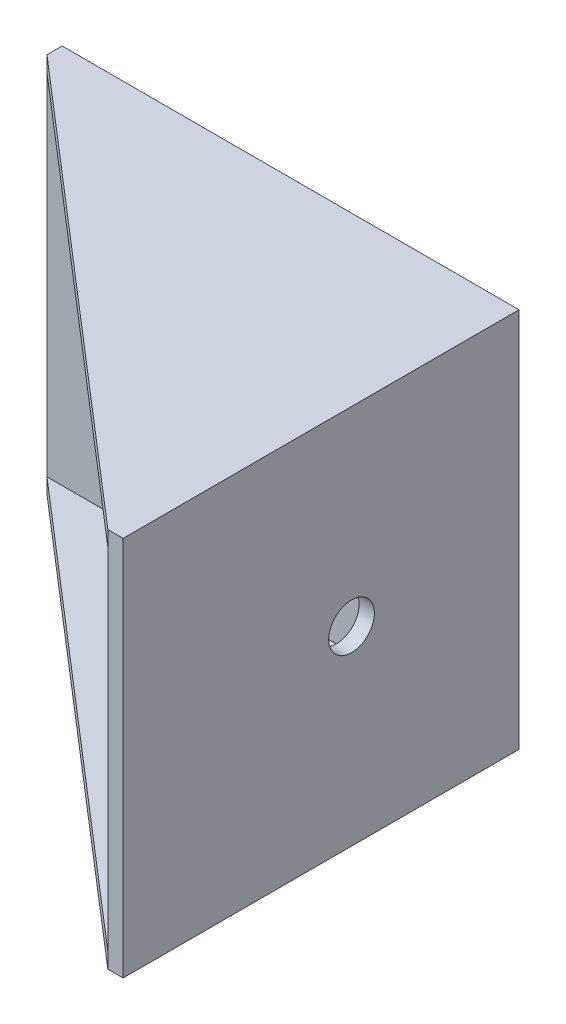
ISO-10303-21;
HEADER;
FILE_DESCRIPTION(('STEP AP214'),'2;1');
FILE_NAME('part.step','',(''),(''),'','','');
FILE_SCHEMA(('AUTOMOTIVE_DESIGN { 1 0 10303 214 1 1 1 1 }'));
ENDSEC;
DATA;
#1=APPLICATION_CONTEXT('core data for automotive mechanical design processes');
#2=APPLICATION_PROTOCOL_DEFINITION('international standard','automotive_design',2000,#1);
#3=PRODUCT_CONTEXT('',#1,'mechanical');
#4=PRODUCT('Part','Part','',(#3));
#5=PRODUCT_RELATED_PRODUCT_CATEGORY('part','',(#4));
#6=PRODUCT_DEFINITION_FORMATION('','',#4);
#7=PRODUCT_DEFINITION_CONTEXT('part definition',#1,'design');
#8=PRODUCT_DEFINITION('design','',#6,#7);
#9=PRODUCT_DEFINITION_SHAPE('','',#8);
#10=(LENGTH_UNIT() NAMED_UNIT(*) SI_UNIT(.MILLI.,.METRE.));
#11=(NAMED_UNIT(*) PLANE_ANGLE_UNIT() SI_UNIT($,.RADIAN.));
#12=(NAMED_UNIT(*) SI_UNIT($,.STERADIAN.) SOLID_ANGLE_UNIT());
#13=UNCERTAINTY_MEASURE_WITH_UNIT(LENGTH_MEASURE(1.E-05),#10,'distance_accuracy_value','');
#14=(GEOMETRIC_REPRESENTATION_CONTEXT(3) GLOBAL_UNCERTAINTY_ASSIGNED_CONTEXT((#13)) GLOBAL_UNIT_ASSIGNED_CONTEXT((#10,
#11,#12)) REPRESENTATION_CONTEXT('',''));
#15=CARTESIAN_POINT('',(0.,0.,0.));
#16=DIRECTION('',(0.,0.,1.));
#17=DIRECTION('',(1.,0.,0.));
#18=AXIS2_PLACEMENT_3D('',#15,#16,#17);
#19=CARTESIAN_POINT('',(15.,12.5,1.));
#20=DIRECTION('',(-1.,0.,0.));
#21=DIRECTION('',(0.,-1.,0.));
#22=AXIS2_PLACEMENT_3D('',#19,#20,#21);
#23=PLANE('',#22);
#24=CARTESIAN_POINT('',(15.,0.,11.));
#25=DIRECTION('',(-1.,0.,0.));
#26=DIRECTION('',(0.,-1.,0.));
#27=AXIS2_PLACEMENT_3D('',#24,#25,#26);
#28=CIRCLE('',#27,1.5);
#29=CARTESIAN_POINT('',(15.,-1.5,11.));
#30=VERTEX_POINT('',#29);
#31=EDGE_CURVE('E180',#30,#30,#28,.T.);
#32=ORIENTED_EDGE('',*,*,#31,.T.);
#33=EDGE_LOOP('',(#32));
#34=FACE_BOUND('',#33,.T.);
#35=DIRECTION('',(0.,1.,0.));
#36=VECTOR('',#35,1.);
#37=CARTESIAN_POINT('',(15.,12.5,0.));
#38=LINE('',#37,#36);
#39=CARTESIAN_POINT('',(15.,-12.5,0.));
#40=VERTEX_POINT('',#39);
#41=CARTESIAN_POINT('',(15.,12.5,0.));
#42=VERTEX_POINT('',#41);
#43=EDGE_CURVE('E133',#40,#42,#38,.T.);
#44=ORIENTED_EDGE('',*,*,#43,.T.);
#45=DIRECTION('',(0.,0.,-1.));
#46=VECTOR('',#45,1.);
#47=CARTESIAN_POINT('',(15.,12.5,1.));
#48=LINE('',#47,#46);
#49=CARTESIAN_POINT('',(15.,12.5,26.));
#50=VERTEX_POINT('',#49);
#51=EDGE_CURVE('E11',#50,#42,#48,.T.);
#52=ORIENTED_EDGE('',*,*,#51,.F.);
#53=DIRECTION('',(0.,1.,0.));
#54=VECTOR('',#53,1.);
#55=CARTESIAN_POINT('',(15.,-12.5,26.));
#56=LINE('',#55,#54);
#57=CARTESIAN_POINT('',(15.,-12.5,26.));
#58=VERTEX_POINT('',#57);
#59=EDGE_CURVE('E117',#58,#50,#56,.T.);
#60=ORIENTED_EDGE('',*,*,#59,.F.);
#61=DIRECTION('',(0.,0.,-1.));
#62=VECTOR('',#61,1.);
#63=CARTESIAN_POINT('',(15.,-12.5,1.));
#64=LINE('',#63,#62);
#65=EDGE_CURVE('E131',#58,#40,#64,.T.);
#66=ORIENTED_EDGE('',*,*,#65,.T.);
#67=EDGE_LOOP('',(#44,#52,#60,#66));
#68=FACE_BOUND('',#67,.T.);
#69=ADVANCED_FACE('F32',(#34,#68),#23,.F.);
#70=CARTESIAN_POINT('',(-15.,12.5,1.));
#71=DIRECTION('',(0.,-1.,0.));
#72=DIRECTION('',(0.,0.,-1.));
#73=AXIS2_PLACEMENT_3D('',#70,#71,#72);
#74=PLANE('',#73);
#75=DIRECTION('',(0.,0.,-1.));
#76=VECTOR('',#75,1.);
#77=CARTESIAN_POINT('',(-15.,12.5,1.));
#78=LINE('',#77,#76);
#79=CARTESIAN_POINT('',(-15.,12.5,1.));
#80=VERTEX_POINT('',#79);
#81=CARTESIAN_POINT('',(-15.,12.5,0.));
#82=VERTEX_POINT('',#81);
#83=EDGE_CURVE('E39',#80,#82,#78,.T.);
#84=ORIENTED_EDGE('',*,*,#83,.F.);
#85=DIRECTION('',(-0.757409961600577,0.,-0.652939622069463));
#86=VECTOR('',#85,1.);
#87=CARTESIAN_POINT('',(14.,12.5,26.));
#88=LINE('',#87,#86);
#89=CARTESIAN_POINT('',(14.,12.5,26.));
#90=VERTEX_POINT('',#89);
#91=EDGE_CURVE('E111',#90,#80,#88,.T.);
#92=ORIENTED_EDGE('',*,*,#91,.F.);
#93=DIRECTION('',(-1.,0.,0.));
#94=VECTOR('',#93,1.);
#95=CARTESIAN_POINT('',(15.,12.5,26.));
#96=LINE('',#95,#94);
#97=EDGE_CURVE('E121',#50,#90,#96,.T.);
#98=ORIENTED_EDGE('',*,*,#97,.F.);
#99=ORIENTED_EDGE('',*,*,#51,.T.);
#100=DIRECTION('',(-1.,0.,0.));
#101=VECTOR('',#100,1.);
#102=CARTESIAN_POINT('',(-15.,12.5,0.));
#103=LINE('',#102,#101);
#104=EDGE_CURVE('E136',#42,#82,#103,.T.);
#105=ORIENTED_EDGE('',*,*,#104,.T.);
#106=EDGE_LOOP('',(#84,#92,#98,#99,#105));
#107=FACE_BOUND('',#106,.T.);
#108=ADVANCED_FACE('F202',(#107),#74,.F.);
#109=CARTESIAN_POINT('',(-15.,12.5,1.));
#110=DIRECTION('',(1.,0.,0.));
#111=DIRECTION('',(0.,1.,0.));
#112=AXIS2_PLACEMENT_3D('',#109,#110,#111);
#113=PLANE('',#112);
#114=DIRECTION('',(0.,-1.,0.));
#115=VECTOR('',#114,1.);
#116=CARTESIAN_POINT('',(-15.,12.5,0.));
#117=LINE('',#116,#115);
#118=CARTESIAN_POINT('',(-15.,-12.5,0.));
#119=VERTEX_POINT('',#118);
#120=EDGE_CURVE('E138',#82,#119,#117,.T.);
#121=ORIENTED_EDGE('',*,*,#120,.T.);
#122=DIRECTION('',(0.,0.,-1.));
#123=VECTOR('',#122,1.);
#124=CARTESIAN_POINT('',(-15.,-12.5,1.));
#125=LINE('',#124,#123);
#126=CARTESIAN_POINT('',(-15.,-12.5,1.));
#127=VERTEX_POINT('',#126);
#128=EDGE_CURVE('E142',#127,#119,#125,.T.);
#129=ORIENTED_EDGE('',*,*,#128,.F.);
#130=DIRECTION('',(0.,-1.,0.));
#131=VECTOR('',#130,1.);
#132=CARTESIAN_POINT('',(-15.,-11.5,1.));
#133=LINE('',#132,#131);
#134=CARTESIAN_POINT('',(-15.,-11.5,1.));
#135=VERTEX_POINT('',#134);
#136=EDGE_CURVE('E118',#135,#127,#133,.T.);
#137=ORIENTED_EDGE('',*,*,#136,.F.);
#138=DIRECTION('',(0.,-1.,0.));
#139=VECTOR('',#138,1.);
#140=CARTESIAN_POINT('',(-15.,12.5,1.));
#141=LINE('',#140,#139);
#142=CARTESIAN_POINT('',(-15.,11.5,1.));
#143=VERTEX_POINT('',#142);
#144=EDGE_CURVE('E132',#143,#135,#141,.T.);
#145=ORIENTED_EDGE('',*,*,#144,.F.);
#146=EDGE_CURVE('E129',#80,#143,#141,.T.);
#147=ORIENTED_EDGE('',*,*,#146,.F.);
#148=ORIENTED_EDGE('',*,*,#83,.T.);
#149=EDGE_LOOP('',(#121,#129,#137,#145,#147,#148));
#150=FACE_BOUND('',#149,.T.);
#151=ADVANCED_FACE('F148',(#150),#113,.F.);
#152=CARTESIAN_POINT('',(-15.,-12.5,1.));
#153=DIRECTION('',(0.,1.,0.));
#154=DIRECTION('',(0.,0.,1.));
#155=AXIS2_PLACEMENT_3D('',#152,#153,#154);
#156=PLANE('',#155);
#157=DIRECTION('',(1.,0.,0.));
#158=VECTOR('',#157,1.);
#159=CARTESIAN_POINT('',(-15.,-12.5,0.));
#160=LINE('',#159,#158);
#161=EDGE_CURVE('E54',#119,#40,#160,.T.);
#162=ORIENTED_EDGE('',*,*,#161,.T.);
#163=ORIENTED_EDGE('',*,*,#65,.F.);
#164=DIRECTION('',(1.,0.,0.));
#165=VECTOR('',#164,1.);
#166=CARTESIAN_POINT('',(14.,-12.5,26.));
#167=LINE('',#166,#165);
#168=CARTESIAN_POINT('',(14.,-12.5,26.));
#169=VERTEX_POINT('',#168);
#170=EDGE_CURVE('E127',#169,#58,#167,.T.);
#171=ORIENTED_EDGE('',*,*,#170,.F.);
#172=DIRECTION('',(-0.757409961600577,0.,-0.652939622069463));
#173=VECTOR('',#172,1.);
#174=CARTESIAN_POINT('',(14.,-12.5,26.));
#175=LINE('',#174,#173);
#176=EDGE_CURVE('E171',#169,#127,#175,.T.);
#177=ORIENTED_EDGE('',*,*,#176,.T.);
#178=ORIENTED_EDGE('',*,*,#128,.T.);
#179=EDGE_LOOP('',(#162,#163,#171,#177,#178));
#180=FACE_BOUND('',#179,.T.);
#181=ADVANCED_FACE('F159',(#180),#156,.F.);
#182=CARTESIAN_POINT('',(0.,0.,1.));
#183=DIRECTION('',(0.,0.,1.));
#184=DIRECTION('',(1.,0.,0.));
#185=AXIS2_PLACEMENT_3D('',#182,#183,#184);
#186=PLANE('',#185);
#187=DIRECTION('',(1.,0.,0.));
#188=VECTOR('',#187,1.);
#189=CARTESIAN_POINT('',(-15.,11.5,1.));
#190=LINE('',#189,#188);
#191=CARTESIAN_POINT('',(14.,11.5,1.));
#192=VERTEX_POINT('',#191);
#193=EDGE_CURVE('E95',#143,#192,#190,.T.);
#194=ORIENTED_EDGE('',*,*,#193,.F.);
#195=ORIENTED_EDGE('',*,*,#144,.T.);
#196=DIRECTION('',(1.,0.,0.));
#197=VECTOR('',#196,1.);
#198=CARTESIAN_POINT('',(-15.,-11.5,1.));
#199=LINE('',#198,#197);
#200=CARTESIAN_POINT('',(14.,-11.5,1.));
#201=VERTEX_POINT('',#200);
#202=EDGE_CURVE('E116',#135,#201,#199,.T.);
#203=ORIENTED_EDGE('',*,*,#202,.T.);
#204=DIRECTION('',(0.,-1.,0.));
#205=VECTOR('',#204,1.);
#206=CARTESIAN_POINT('',(14.,12.5,1.));
#207=LINE('',#206,#205);
#208=EDGE_CURVE('E107',#192,#201,#207,.T.);
#209=ORIENTED_EDGE('',*,*,#208,.F.);
#210=EDGE_LOOP('',(#194,#195,#203,#209));
#211=FACE_BOUND('',#210,.T.);
#212=ADVANCED_FACE('F114',(#211),#186,.T.);
#213=CARTESIAN_POINT('',(0.,0.,0.));
#214=DIRECTION('',(0.,0.,1.));
#215=DIRECTION('',(1.,0.,0.));
#216=AXIS2_PLACEMENT_3D('',#213,#214,#215);
#217=PLANE('',#216);
#218=ORIENTED_EDGE('',*,*,#43,.F.);
#219=ORIENTED_EDGE('',*,*,#161,.F.);
#220=ORIENTED_EDGE('',*,*,#120,.F.);
#221=ORIENTED_EDGE('',*,*,#104,.F.);
#222=EDGE_LOOP('',(#218,#219,#220,#221));
#223=FACE_BOUND('',#222,.T.);
#224=ADVANCED_FACE('F153',(#223),#217,.F.);
#225=CARTESIAN_POINT('',(14.,12.5,26.));
#226=DIRECTION('',(1.,0.,0.));
#227=DIRECTION('',(0.,1.,0.));
#228=AXIS2_PLACEMENT_3D('',#225,#226,#227);
#229=PLANE('',#228);
#230=CARTESIAN_POINT('',(14.,0.,11.));
#231=DIRECTION('',(-1.,0.,0.));
#232=DIRECTION('',(0.,-1.,0.));
#233=AXIS2_PLACEMENT_3D('',#230,#231,#232);
#234=CIRCLE('',#233,1.5);
#235=CARTESIAN_POINT('',(14.,-1.5,11.));
#236=VERTEX_POINT('',#235);
#237=EDGE_CURVE('E184',#236,#236,#234,.T.);
#238=ORIENTED_EDGE('',*,*,#237,.F.);
#239=EDGE_LOOP('',(#238));
#240=FACE_BOUND('',#239,.T.);
#241=DIRECTION('',(0.,-1.,0.));
#242=VECTOR('',#241,1.);
#243=CARTESIAN_POINT('',(14.,12.5,26.));
#244=LINE('',#243,#242);
#245=CARTESIAN_POINT('',(14.,11.5,26.));
#246=VERTEX_POINT('',#245);
#247=CARTESIAN_POINT('',(14.,-11.5,26.));
#248=VERTEX_POINT('',#247);
#249=EDGE_CURVE('E109',#246,#248,#244,.T.);
#250=ORIENTED_EDGE('',*,*,#249,.F.);
#251=DIRECTION('',(0.,0.,1.));
#252=VECTOR('',#251,1.);
#253=CARTESIAN_POINT('',(14.,11.5,1.));
#254=LINE('',#253,#252);
#255=EDGE_CURVE('E46',#192,#246,#254,.T.);
#256=ORIENTED_EDGE('',*,*,#255,.F.);
#257=ORIENTED_EDGE('',*,*,#208,.T.);
#258=DIRECTION('',(0.,0.,1.));
#259=VECTOR('',#258,1.);
#260=CARTESIAN_POINT('',(14.,-11.5,1.));
#261=LINE('',#260,#259);
#262=EDGE_CURVE('E173',#201,#248,#261,.T.);
#263=ORIENTED_EDGE('',*,*,#262,.T.);
#264=EDGE_LOOP('',(#250,#256,#257,#263));
#265=FACE_BOUND('',#264,.T.);
#266=ADVANCED_FACE('F105',(#240,#265),#229,.F.);
#267=CARTESIAN_POINT('',(0.,0.,26.));
#268=DIRECTION('',(0.,0.,1.));
#269=DIRECTION('',(1.,0.,0.));
#270=AXIS2_PLACEMENT_3D('',#267,#268,#269);
#271=PLANE('',#270);
#272=ORIENTED_EDGE('',*,*,#59,.T.);
#273=ORIENTED_EDGE('',*,*,#97,.T.);
#274=EDGE_CURVE('E166',#90,#246,#244,.T.);
#275=ORIENTED_EDGE('',*,*,#274,.T.);
#276=ORIENTED_EDGE('',*,*,#249,.T.);
#277=DIRECTION('',(0.,-1.,0.));
#278=VECTOR('',#277,1.);
#279=CARTESIAN_POINT('',(14.,-11.5,26.));
#280=LINE('',#279,#278);
#281=EDGE_CURVE('E123',#248,#169,#280,.T.);
#282=ORIENTED_EDGE('',*,*,#281,.T.);
#283=ORIENTED_EDGE('',*,*,#170,.T.);
#284=EDGE_LOOP('',(#272,#273,#275,#276,#282,#283));
#285=FACE_BOUND('',#284,.T.);
#286=ADVANCED_FACE('F163',(#285),#271,.T.);
#287=CARTESIAN_POINT('',(14.,-11.5,26.));
#288=DIRECTION('',(-0.652939622069463,0.,0.757409961600577));
#289=DIRECTION('',(0.757409961600577,0.,0.652939622069463));
#290=AXIS2_PLACEMENT_3D('',#287,#288,#289);
#291=PLANE('',#290);
#292=ORIENTED_EDGE('',*,*,#176,.F.);
#293=ORIENTED_EDGE('',*,*,#281,.F.);
#294=DIRECTION('',(-0.757409961600577,0.,-0.652939622069463));
#295=VECTOR('',#294,1.);
#296=CARTESIAN_POINT('',(14.,-11.5,26.));
#297=LINE('',#296,#295);
#298=EDGE_CURVE('E175',#248,#135,#297,.T.);
#299=ORIENTED_EDGE('',*,*,#298,.T.);
#300=ORIENTED_EDGE('',*,*,#136,.T.);
#301=EDGE_LOOP('',(#292,#293,#299,#300));
#302=FACE_BOUND('',#301,.T.);
#303=ADVANCED_FACE('F197',(#302),#291,.T.);
#304=CARTESIAN_POINT('',(0.,-11.5,0.));
#305=DIRECTION('',(0.,1.,0.));
#306=DIRECTION('',(0.,0.,1.));
#307=AXIS2_PLACEMENT_3D('',#304,#305,#306);
#308=PLANE('',#307);
#309=ORIENTED_EDGE('',*,*,#262,.F.);
#310=ORIENTED_EDGE('',*,*,#202,.F.);
#311=ORIENTED_EDGE('',*,*,#298,.F.);
#312=EDGE_LOOP('',(#309,#310,#311));
#313=FACE_BOUND('',#312,.T.);
#314=ADVANCED_FACE('F218',(#313),#308,.T.);
#315=CARTESIAN_POINT('',(14.,11.5,26.));
#316=DIRECTION('',(0.652939622069463,0.,-0.757409961600577));
#317=DIRECTION('',(-0.757409961600577,0.,-0.652939622069463));
#318=AXIS2_PLACEMENT_3D('',#315,#316,#317);
#319=PLANE('',#318);
#320=ORIENTED_EDGE('',*,*,#91,.T.);
#321=ORIENTED_EDGE('',*,*,#146,.T.);
#322=DIRECTION('',(-0.757409961600577,0.,-0.652939622069463));
#323=VECTOR('',#322,1.);
#324=CARTESIAN_POINT('',(14.,11.5,26.));
#325=LINE('',#324,#323);
#326=EDGE_CURVE('E97',#246,#143,#325,.T.);
#327=ORIENTED_EDGE('',*,*,#326,.F.);
#328=ORIENTED_EDGE('',*,*,#274,.F.);
#329=EDGE_LOOP('',(#320,#321,#327,#328));
#330=FACE_BOUND('',#329,.T.);
#331=ADVANCED_FACE('F213',(#330),#319,.F.);
#332=CARTESIAN_POINT('',(0.,11.5,0.));
#333=DIRECTION('',(0.,-1.,0.));
#334=DIRECTION('',(0.,0.,1.));
#335=AXIS2_PLACEMENT_3D('',#332,#333,#334);
#336=PLANE('',#335);
#337=ORIENTED_EDGE('',*,*,#255,.T.);
#338=ORIENTED_EDGE('',*,*,#326,.T.);
#339=ORIENTED_EDGE('',*,*,#193,.T.);
#340=EDGE_LOOP('',(#337,#338,#339));
#341=FACE_BOUND('',#340,.T.);
#342=ADVANCED_FACE('F96',(#341),#336,.T.);
#343=CARTESIAN_POINT('',(17.,0.,11.));
#344=DIRECTION('',(-1.,0.,0.));
#345=DIRECTION('',(0.,-1.,0.));
#346=AXIS2_PLACEMENT_3D('',#343,#344,#345);
#347=CYLINDRICAL_SURFACE('',#346,1.5);
#348=ORIENTED_EDGE('',*,*,#237,.T.);
#349=EDGE_LOOP('',(#348));
#350=FACE_BOUND('',#349,.T.);
#351=ORIENTED_EDGE('',*,*,#31,.F.);
#352=EDGE_LOOP('',(#351));
#353=FACE_BOUND('',#352,.T.);
#354=ADVANCED_FACE('F188',(#350,#353),#347,.F.);
#355=CLOSED_SHELL('',(#69,#108,#151,#181,#212,#224,#266,#286,#303,#314,#331,#342,#354));
#356=MANIFOLD_SOLID_BREP('B2',#355);
#357=ADVANCED_BREP_SHAPE_REPRESENTATION('',(#18,#356),#14);
#358=SHAPE_DEFINITION_REPRESENTATION(#9,#357);
ENDSEC;
END-ISO-10303-21;
